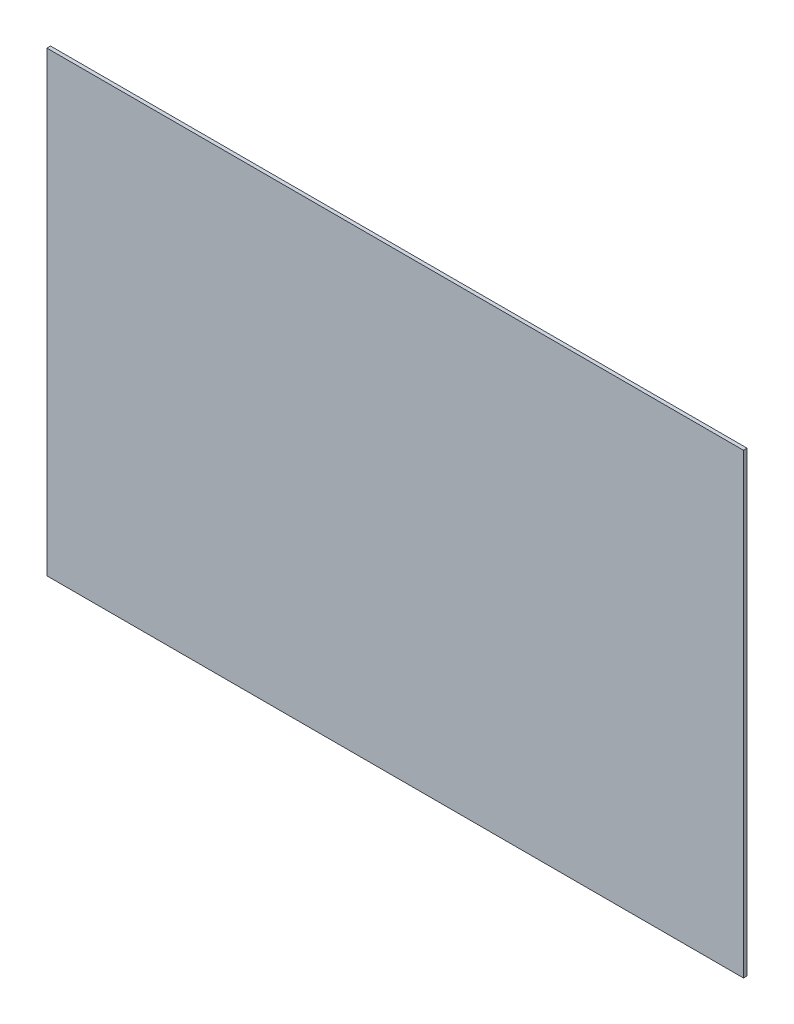
ISO-10303-21;
HEADER;
FILE_DESCRIPTION(('STEP AP214'),'2;1');
FILE_NAME('part.step','',(''),(''),'','','');
FILE_SCHEMA(('AUTOMOTIVE_DESIGN { 1 0 10303 214 1 1 1 1 }'));
ENDSEC;
DATA;
#1=APPLICATION_CONTEXT('core data for automotive mechanical design processes');
#2=APPLICATION_PROTOCOL_DEFINITION('international standard','automotive_design',2000,#1);
#3=PRODUCT_CONTEXT('',#1,'mechanical');
#4=PRODUCT('Part','Part','',(#3));
#5=PRODUCT_RELATED_PRODUCT_CATEGORY('part','',(#4));
#6=PRODUCT_DEFINITION_FORMATION('','',#4);
#7=PRODUCT_DEFINITION_CONTEXT('part definition',#1,'design');
#8=PRODUCT_DEFINITION('design','',#6,#7);
#9=PRODUCT_DEFINITION_SHAPE('','',#8);
#10=(LENGTH_UNIT() NAMED_UNIT(*) SI_UNIT(.MILLI.,.METRE.));
#11=(NAMED_UNIT(*) PLANE_ANGLE_UNIT() SI_UNIT($,.RADIAN.));
#12=(NAMED_UNIT(*) SI_UNIT($,.STERADIAN.) SOLID_ANGLE_UNIT());
#13=UNCERTAINTY_MEASURE_WITH_UNIT(LENGTH_MEASURE(1.E-05),#10,'distance_accuracy_value','');
#14=(GEOMETRIC_REPRESENTATION_CONTEXT(3) GLOBAL_UNCERTAINTY_ASSIGNED_CONTEXT((#13)) GLOBAL_UNIT_ASSIGNED_CONTEXT((#10,
#11,#12)) REPRESENTATION_CONTEXT('',''));
#15=CARTESIAN_POINT('',(0.,0.,0.));
#16=DIRECTION('',(0.,0.,1.));
#17=DIRECTION('',(1.,0.,0.));
#18=AXIS2_PLACEMENT_3D('',#15,#16,#17);
#19=CARTESIAN_POINT('',(0.,0.,6.35));
#20=DIRECTION('',(0.,1.,0.));
#21=DIRECTION('',(0.,0.,1.));
#22=AXIS2_PLACEMENT_3D('',#19,#20,#21);
#23=PLANE('',#22);
#24=DIRECTION('',(1.,0.,0.));
#25=VECTOR('',#24,1.);
#26=CARTESIAN_POINT('',(0.,0.,0.));
#27=LINE('',#26,#25);
#28=CARTESIAN_POINT('',(0.,0.,0.));
#29=VERTEX_POINT('',#28);
#30=CARTESIAN_POINT('',(1219.2,0.,0.));
#31=VERTEX_POINT('',#30);
#32=EDGE_CURVE('E115',#29,#31,#27,.T.);
#33=ORIENTED_EDGE('',*,*,#32,.T.);
#34=DIRECTION('',(0.,0.,-1.));
#35=VECTOR('',#34,1.);
#36=CARTESIAN_POINT('',(1219.2,0.,6.35));
#37=LINE('',#36,#35);
#38=CARTESIAN_POINT('',(1219.2,0.,6.35));
#39=VERTEX_POINT('',#38);
#40=EDGE_CURVE('E11',#39,#31,#37,.T.);
#41=ORIENTED_EDGE('',*,*,#40,.F.);
#42=DIRECTION('',(1.,0.,0.));
#43=VECTOR('',#42,1.);
#44=CARTESIAN_POINT('',(0.,0.,6.35));
#45=LINE('',#44,#43);
#46=CARTESIAN_POINT('',(0.,0.,6.35));
#47=VERTEX_POINT('',#46);
#48=EDGE_CURVE('E97',#47,#39,#45,.T.);
#49=ORIENTED_EDGE('',*,*,#48,.F.);
#50=DIRECTION('',(0.,0.,-1.));
#51=VECTOR('',#50,1.);
#52=CARTESIAN_POINT('',(0.,0.,6.35));
#53=LINE('',#52,#51);
#54=EDGE_CURVE('E64',#47,#29,#53,.T.);
#55=ORIENTED_EDGE('',*,*,#54,.T.);
#56=EDGE_LOOP('',(#33,#41,#49,#55));
#57=FACE_BOUND('',#56,.T.);
#58=ADVANCED_FACE('F47',(#57),#23,.F.);
#59=CARTESIAN_POINT('',(1219.2,0.,6.35));
#60=DIRECTION('',(-1.,0.,0.));
#61=DIRECTION('',(0.,0.,1.));
#62=AXIS2_PLACEMENT_3D('',#59,#60,#61);
#63=PLANE('',#62);
#64=DIRECTION('',(0.,1.,0.));
#65=VECTOR('',#64,1.);
#66=CARTESIAN_POINT('',(1219.2,0.,0.));
#67=LINE('',#66,#65);
#68=CARTESIAN_POINT('',(1219.2,800.,0.));
#69=VERTEX_POINT('',#68);
#70=EDGE_CURVE('E103',#31,#69,#67,.T.);
#71=ORIENTED_EDGE('',*,*,#70,.T.);
#72=DIRECTION('',(0.,0.,-1.));
#73=VECTOR('',#72,1.);
#74=CARTESIAN_POINT('',(1219.2,800.,6.35));
#75=LINE('',#74,#73);
#76=CARTESIAN_POINT('',(1219.2,800.,6.35));
#77=VERTEX_POINT('',#76);
#78=EDGE_CURVE('E56',#77,#69,#75,.T.);
#79=ORIENTED_EDGE('',*,*,#78,.F.);
#80=DIRECTION('',(0.,1.,0.));
#81=VECTOR('',#80,1.);
#82=CARTESIAN_POINT('',(1219.2,0.,6.35));
#83=LINE('',#82,#81);
#84=EDGE_CURVE('E89',#39,#77,#83,.T.);
#85=ORIENTED_EDGE('',*,*,#84,.F.);
#86=ORIENTED_EDGE('',*,*,#40,.T.);
#87=EDGE_LOOP('',(#71,#79,#85,#86));
#88=FACE_BOUND('',#87,.T.);
#89=ADVANCED_FACE('F102',(#88),#63,.F.);
#90=CARTESIAN_POINT('',(0.,800.,6.35));
#91=DIRECTION('',(0.,1.,0.));
#92=DIRECTION('',(0.,0.,1.));
#93=AXIS2_PLACEMENT_3D('',#90,#91,#92);
#94=PLANE('',#93);
#95=DIRECTION('',(1.,0.,0.));
#96=VECTOR('',#95,1.);
#97=CARTESIAN_POINT('',(0.,800.,0.));
#98=LINE('',#97,#96);
#99=CARTESIAN_POINT('',(0.,800.,0.));
#100=VERTEX_POINT('',#99);
#101=EDGE_CURVE('E120',#100,#69,#98,.T.);
#102=ORIENTED_EDGE('',*,*,#101,.F.);
#103=DIRECTION('',(0.,0.,-1.));
#104=VECTOR('',#103,1.);
#105=CARTESIAN_POINT('',(0.,800.,6.35));
#106=LINE('',#105,#104);
#107=CARTESIAN_POINT('',(0.,800.,6.35));
#108=VERTEX_POINT('',#107);
#109=EDGE_CURVE('E78',#108,#100,#106,.T.);
#110=ORIENTED_EDGE('',*,*,#109,.F.);
#111=DIRECTION('',(1.,0.,0.));
#112=VECTOR('',#111,1.);
#113=CARTESIAN_POINT('',(0.,800.,6.35));
#114=LINE('',#113,#112);
#115=EDGE_CURVE('E96',#108,#77,#114,.T.);
#116=ORIENTED_EDGE('',*,*,#115,.T.);
#117=ORIENTED_EDGE('',*,*,#78,.T.);
#118=EDGE_LOOP('',(#102,#110,#116,#117));
#119=FACE_BOUND('',#118,.T.);
#120=ADVANCED_FACE('F107',(#119),#94,.T.);
#121=CARTESIAN_POINT('',(0.,0.,6.35));
#122=DIRECTION('',(-1.,0.,0.));
#123=DIRECTION('',(0.,-1.,0.));
#124=AXIS2_PLACEMENT_3D('',#121,#122,#123);
#125=PLANE('',#124);
#126=DIRECTION('',(0.,1.,0.));
#127=VECTOR('',#126,1.);
#128=CARTESIAN_POINT('',(0.,0.,0.));
#129=LINE('',#128,#127);
#130=EDGE_CURVE('E123',#29,#100,#129,.T.);
#131=ORIENTED_EDGE('',*,*,#130,.F.);
#132=ORIENTED_EDGE('',*,*,#54,.F.);
#133=DIRECTION('',(0.,1.,0.));
#134=VECTOR('',#133,1.);
#135=CARTESIAN_POINT('',(0.,0.,6.35));
#136=LINE('',#135,#134);
#137=EDGE_CURVE('E109',#47,#108,#136,.T.);
#138=ORIENTED_EDGE('',*,*,#137,.T.);
#139=ORIENTED_EDGE('',*,*,#109,.T.);
#140=EDGE_LOOP('',(#131,#132,#138,#139));
#141=FACE_BOUND('',#140,.T.);
#142=ADVANCED_FACE('F133',(#141),#125,.T.);
#143=CARTESIAN_POINT('',(0.,0.,6.35));
#144=DIRECTION('',(0.,0.,1.));
#145=DIRECTION('',(1.,0.,0.));
#146=AXIS2_PLACEMENT_3D('',#143,#144,#145);
#147=PLANE('',#146);
#148=ORIENTED_EDGE('',*,*,#48,.T.);
#149=ORIENTED_EDGE('',*,*,#84,.T.);
#150=ORIENTED_EDGE('',*,*,#115,.F.);
#151=ORIENTED_EDGE('',*,*,#137,.F.);
#152=EDGE_LOOP('',(#148,#149,#150,#151));
#153=FACE_BOUND('',#152,.T.);
#154=ADVANCED_FACE('F93',(#153),#147,.T.);
#155=CARTESIAN_POINT('',(0.,0.,0.));
#156=DIRECTION('',(0.,0.,1.));
#157=DIRECTION('',(1.,0.,0.));
#158=AXIS2_PLACEMENT_3D('',#155,#156,#157);
#159=PLANE('',#158);
#160=ORIENTED_EDGE('',*,*,#32,.F.);
#161=ORIENTED_EDGE('',*,*,#130,.T.);
#162=ORIENTED_EDGE('',*,*,#101,.T.);
#163=ORIENTED_EDGE('',*,*,#70,.F.);
#164=EDGE_LOOP('',(#160,#161,#162,#163));
#165=FACE_BOUND('',#164,.T.);
#166=ADVANCED_FACE('F132',(#165),#159,.F.);
#167=CLOSED_SHELL('',(#58,#89,#120,#142,#154,#166));
#168=MANIFOLD_SOLID_BREP('B2',#167);
#169=ADVANCED_BREP_SHAPE_REPRESENTATION('',(#18,#168),#14);
#170=SHAPE_DEFINITION_REPRESENTATION(#9,#169);
ENDSEC;
END-ISO-10303-21;
